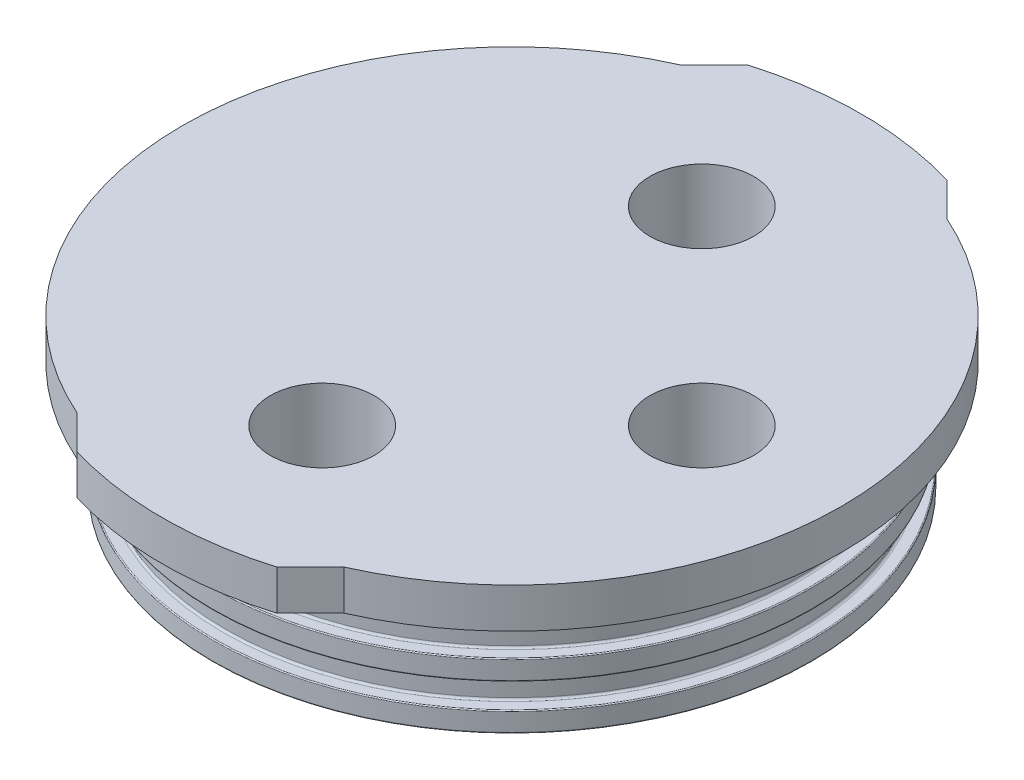
ISO-10303-21;
HEADER;
FILE_DESCRIPTION(('STEP AP214'),'2;1');
FILE_NAME('part.step','',(''),(''),'','','');
FILE_SCHEMA(('AUTOMOTIVE_DESIGN { 1 0 10303 214 1 1 1 1 }'));
ENDSEC;
DATA;
#1=APPLICATION_CONTEXT('core data for automotive mechanical design processes');
#2=APPLICATION_PROTOCOL_DEFINITION('international standard','automotive_design',2000,#1);
#3=PRODUCT_CONTEXT('',#1,'mechanical');
#4=PRODUCT('Part','Part','',(#3));
#5=PRODUCT_RELATED_PRODUCT_CATEGORY('part','',(#4));
#6=PRODUCT_DEFINITION_FORMATION('','',#4);
#7=PRODUCT_DEFINITION_CONTEXT('part definition',#1,'design');
#8=PRODUCT_DEFINITION('design','',#6,#7);
#9=PRODUCT_DEFINITION_SHAPE('','',#8);
#10=(LENGTH_UNIT() NAMED_UNIT(*) SI_UNIT(.MILLI.,.METRE.));
#11=(NAMED_UNIT(*) PLANE_ANGLE_UNIT() SI_UNIT($,.RADIAN.));
#12=(NAMED_UNIT(*) SI_UNIT($,.STERADIAN.) SOLID_ANGLE_UNIT());
#13=UNCERTAINTY_MEASURE_WITH_UNIT(LENGTH_MEASURE(1.E-05),#10,'distance_accuracy_value','');
#14=(GEOMETRIC_REPRESENTATION_CONTEXT(3) GLOBAL_UNCERTAINTY_ASSIGNED_CONTEXT((#13)) GLOBAL_UNIT_ASSIGNED_CONTEXT((#10,
#11,#12)) REPRESENTATION_CONTEXT('',''));
#15=CARTESIAN_POINT('',(0.,0.,0.));
#16=DIRECTION('',(0.,0.,1.));
#17=DIRECTION('',(1.,0.,0.));
#18=AXIS2_PLACEMENT_3D('',#15,#16,#17);
#19=CARTESIAN_POINT('',(0.,0.,0.));
#20=DIRECTION('',(0.,-1.,0.));
#21=DIRECTION('',(0.,0.,-1.));
#22=AXIS2_PLACEMENT_3D('',#19,#20,#21);
#23=CYLINDRICAL_SURFACE('',#22,33.);
#24=CARTESIAN_POINT('',(0.,11.,0.));
#25=DIRECTION('',(0.,-1.,0.));
#26=DIRECTION('',(0.,0.,-1.));
#27=AXIS2_PLACEMENT_3D('',#24,#25,#26);
#28=CIRCLE('',#27,33.);
#29=CARTESIAN_POINT('',(-13.3714085884062,11.,30.1696110740907));
#30=VERTEX_POINT('',#29);
#31=CARTESIAN_POINT('',(-13.3714085884061,11.,-30.1696110740907));
#32=VERTEX_POINT('',#31);
#33=EDGE_CURVE('E183',#30,#32,#28,.T.);
#34=ORIENTED_EDGE('',*,*,#33,.F.);
#35=DIRECTION('',(0.,1.,0.));
#36=VECTOR('',#35,1.);
#37=CARTESIAN_POINT('',(-13.3714085884062,-16.175557542173,30.1696110740907));
#38=LINE('',#37,#36);
#39=CARTESIAN_POINT('',(-13.3714085884062,15.,30.1696110740907));
#40=VERTEX_POINT('',#39);
#41=EDGE_CURVE('E51',#30,#40,#38,.T.);
#42=ORIENTED_EDGE('',*,*,#41,.T.);
#43=CARTESIAN_POINT('',(0.,15.,0.));
#44=DIRECTION('',(0.,-1.,0.));
#45=DIRECTION('',(0.,0.,-1.));
#46=AXIS2_PLACEMENT_3D('',#43,#44,#45);
#47=CIRCLE('',#46,33.);
#48=CARTESIAN_POINT('',(-13.3714085884061,15.,-30.1696110740907));
#49=VERTEX_POINT('',#48);
#50=EDGE_CURVE('E187',#40,#49,#47,.T.);
#51=ORIENTED_EDGE('',*,*,#50,.T.);
#52=DIRECTION('',(0.,1.,0.));
#53=VECTOR('',#52,1.);
#54=CARTESIAN_POINT('',(-13.3714085884061,-16.175557542173,-30.1696110740907));
#55=LINE('',#54,#53);
#56=EDGE_CURVE('E157',#32,#49,#55,.T.);
#57=ORIENTED_EDGE('',*,*,#56,.F.);
#58=EDGE_LOOP('',(#34,#42,#51,#57));
#59=FACE_BOUND('',#58,.T.);
#60=ADVANCED_FACE('F36',(#59),#23,.T.);
#61=CARTESIAN_POINT('',(0.,15.,0.));
#62=DIRECTION('',(0.,-1.,0.));
#63=DIRECTION('',(0.,0.,-1.));
#64=AXIS2_PLACEMENT_3D('',#61,#62,#63);
#65=PLANE('',#64);
#66=CARTESIAN_POINT('',(0.,15.,19.));
#67=DIRECTION('',(0.,-1.,0.));
#68=DIRECTION('',(0.,0.,-1.));
#69=AXIS2_PLACEMENT_3D('',#66,#67,#68);
#70=CIRCLE('',#69,5.2);
#71=CARTESIAN_POINT('',(0.,15.,13.8));
#72=VERTEX_POINT('',#71);
#73=EDGE_CURVE('E168',#72,#72,#70,.T.);
#74=ORIENTED_EDGE('',*,*,#73,.T.);
#75=EDGE_LOOP('',(#74));
#76=FACE_BOUND('',#75,.T.);
#77=CARTESIAN_POINT('',(13.3714085884062,15.,-30.1696110740907));
#78=VERTEX_POINT('',#77);
#79=CARTESIAN_POINT('',(13.3714085884061,15.,30.1696110740907));
#80=VERTEX_POINT('',#79);
#81=EDGE_CURVE('E188',#78,#80,#47,.T.);
#82=ORIENTED_EDGE('',*,*,#81,.F.);
#83=DIRECTION('',(-0.70710678118655,0.,-0.707106781186545));
#84=VECTOR('',#83,1.);
#85=CARTESIAN_POINT('',(10.,15.,-33.5410196624969));
#86=LINE('',#85,#84);
#87=CARTESIAN_POINT('',(10.,15.,-33.5410196624969));
#88=VERTEX_POINT('',#87);
#89=EDGE_CURVE('E148',#78,#88,#86,.T.);
#90=ORIENTED_EDGE('',*,*,#89,.T.);
#91=CARTESIAN_POINT('',(0.,15.,0.));
#92=DIRECTION('',(0.,1.,0.));
#93=DIRECTION('',(0.,0.,1.));
#94=AXIS2_PLACEMENT_3D('',#91,#92,#93);
#95=CIRCLE('',#94,35.);
#96=CARTESIAN_POINT('',(-10.,15.,-33.5410196624969));
#97=VERTEX_POINT('',#96);
#98=EDGE_CURVE('E151',#88,#97,#95,.T.);
#99=ORIENTED_EDGE('',*,*,#98,.T.);
#100=DIRECTION('',(-0.70710678118655,0.,0.707106781186545));
#101=VECTOR('',#100,1.);
#102=CARTESIAN_POINT('',(-10.,15.,-33.5410196624969));
#103=LINE('',#102,#101);
#104=EDGE_CURVE('E139',#97,#49,#103,.T.);
#105=ORIENTED_EDGE('',*,*,#104,.T.);
#106=ORIENTED_EDGE('',*,*,#50,.F.);
#107=DIRECTION('',(0.70710678118655,0.,0.707106781186545));
#108=VECTOR('',#107,1.);
#109=CARTESIAN_POINT('',(-10.,15.,33.5410196624969));
#110=LINE('',#109,#108);
#111=CARTESIAN_POINT('',(-10.,15.,33.5410196624969));
#112=VERTEX_POINT('',#111);
#113=EDGE_CURVE('E123',#40,#112,#110,.T.);
#114=ORIENTED_EDGE('',*,*,#113,.T.);
#115=CARTESIAN_POINT('',(0.,15.,0.));
#116=DIRECTION('',(0.,1.,0.));
#117=DIRECTION('',(0.,0.,-1.));
#118=AXIS2_PLACEMENT_3D('',#115,#116,#117);
#119=CIRCLE('',#118,35.);
#120=CARTESIAN_POINT('',(10.,15.,33.5410196624969));
#121=VERTEX_POINT('',#120);
#122=EDGE_CURVE('E108',#112,#121,#119,.T.);
#123=ORIENTED_EDGE('',*,*,#122,.T.);
#124=DIRECTION('',(0.70710678118655,0.,-0.707106781186545));
#125=VECTOR('',#124,1.);
#126=CARTESIAN_POINT('',(10.,15.,33.5410196624969));
#127=LINE('',#126,#125);
#128=EDGE_CURVE('E120',#121,#80,#127,.T.);
#129=ORIENTED_EDGE('',*,*,#128,.T.);
#130=EDGE_LOOP('',(#82,#90,#99,#105,#106,#114,#123,#129));
#131=FACE_BOUND('',#130,.T.);
#132=CARTESIAN_POINT('',(0.,15.,-19.));
#133=DIRECTION('',(0.,1.,0.));
#134=DIRECTION('',(0.,0.,1.));
#135=AXIS2_PLACEMENT_3D('',#132,#133,#134);
#136=CIRCLE('',#135,5.2);
#137=CARTESIAN_POINT('',(0.,15.,-13.8));
#138=VERTEX_POINT('',#137);
#139=EDGE_CURVE('E174',#138,#138,#136,.T.);
#140=ORIENTED_EDGE('',*,*,#139,.F.);
#141=EDGE_LOOP('',(#140));
#142=FACE_BOUND('',#141,.T.);
#143=CARTESIAN_POINT('',(19.,15.,0.));
#144=DIRECTION('',(0.,1.,0.));
#145=DIRECTION('',(-1.,0.,0.));
#146=AXIS2_PLACEMENT_3D('',#143,#144,#145);
#147=CIRCLE('',#146,5.2);
#148=CARTESIAN_POINT('',(13.8,15.,0.));
#149=VERTEX_POINT('',#148);
#150=EDGE_CURVE('E162',#149,#149,#147,.T.);
#151=ORIENTED_EDGE('',*,*,#150,.F.);
#152=EDGE_LOOP('',(#151));
#153=FACE_BOUND('',#152,.T.);
#154=ADVANCED_FACE('F118',(#76,#131,#142,#153),#65,.F.);
#155=CARTESIAN_POINT('',(-30.,0.,0.));
#156=DIRECTION('',(0.,1.,0.));
#157=DIRECTION('',(0.,0.,1.));
#158=AXIS2_PLACEMENT_3D('',#155,#156,#157);
#159=PLANE('',#158);
#160=CARTESIAN_POINT('',(0.,0.,0.));
#161=DIRECTION('',(0.,1.,0.));
#162=DIRECTION('',(0.,0.,1.));
#163=AXIS2_PLACEMENT_3D('',#160,#161,#162);
#164=CIRCLE('',#163,29.9);
#165=CARTESIAN_POINT('',(0.,0.,29.9));
#166=VERTEX_POINT('',#165);
#167=EDGE_CURVE('E217',#166,#166,#164,.F.);
#168=ORIENTED_EDGE('',*,*,#167,.T.);
#169=EDGE_LOOP('',(#168));
#170=FACE_BOUND('',#169,.T.);
#171=CARTESIAN_POINT('',(0.,0.,19.));
#172=DIRECTION('',(0.,-1.,0.));
#173=DIRECTION('',(0.,0.,-1.));
#174=AXIS2_PLACEMENT_3D('',#171,#172,#173);
#175=CIRCLE('',#174,5.2);
#176=CARTESIAN_POINT('',(0.,0.,13.8));
#177=VERTEX_POINT('',#176);
#178=EDGE_CURVE('E171',#177,#177,#175,.T.);
#179=ORIENTED_EDGE('',*,*,#178,.F.);
#180=EDGE_LOOP('',(#179));
#181=FACE_BOUND('',#180,.T.);
#182=CARTESIAN_POINT('',(0.,0.,-19.));
#183=DIRECTION('',(0.,1.,0.));
#184=DIRECTION('',(0.,0.,1.));
#185=AXIS2_PLACEMENT_3D('',#182,#183,#184);
#186=CIRCLE('',#185,5.2);
#187=CARTESIAN_POINT('',(0.,0.,-13.8));
#188=VERTEX_POINT('',#187);
#189=EDGE_CURVE('E177',#188,#188,#186,.T.);
#190=ORIENTED_EDGE('',*,*,#189,.T.);
#191=EDGE_LOOP('',(#190));
#192=FACE_BOUND('',#191,.T.);
#193=CARTESIAN_POINT('',(19.,0.,0.));
#194=DIRECTION('',(0.,1.,0.));
#195=DIRECTION('',(-1.,0.,0.));
#196=AXIS2_PLACEMENT_3D('',#193,#194,#195);
#197=CIRCLE('',#196,5.2);
#198=CARTESIAN_POINT('',(13.8,0.,0.));
#199=VERTEX_POINT('',#198);
#200=EDGE_CURVE('E165',#199,#199,#197,.T.);
#201=ORIENTED_EDGE('',*,*,#200,.T.);
#202=EDGE_LOOP('',(#201));
#203=FACE_BOUND('',#202,.T.);
#204=ADVANCED_FACE('F286',(#170,#181,#192,#203),#159,.F.);
#205=ORIENTED_EDGE('',*,*,#81,.T.);
#206=DIRECTION('',(0.,1.,0.));
#207=VECTOR('',#206,1.);
#208=CARTESIAN_POINT('',(13.3714085884061,-16.175557542173,30.1696110740907));
#209=LINE('',#208,#207);
#210=CARTESIAN_POINT('',(13.3714085884061,11.,30.1696110740907));
#211=VERTEX_POINT('',#210);
#212=EDGE_CURVE('E112',#211,#80,#209,.T.);
#213=ORIENTED_EDGE('',*,*,#212,.F.);
#214=CARTESIAN_POINT('',(13.3714085884062,11.,-30.1696110740907));
#215=VERTEX_POINT('',#214);
#216=EDGE_CURVE('E184',#215,#211,#28,.T.);
#217=ORIENTED_EDGE('',*,*,#216,.F.);
#218=DIRECTION('',(0.,1.,0.));
#219=VECTOR('',#218,1.);
#220=CARTESIAN_POINT('',(13.3714085884062,-16.175557542173,-30.1696110740907));
#221=LINE('',#220,#219);
#222=EDGE_CURVE('E59',#215,#78,#221,.T.);
#223=ORIENTED_EDGE('',*,*,#222,.T.);
#224=EDGE_LOOP('',(#205,#213,#217,#223));
#225=FACE_BOUND('',#224,.T.);
#226=ADVANCED_FACE('F289',(#225),#23,.T.);
#227=CARTESIAN_POINT('',(-33.,11.,0.));
#228=DIRECTION('',(0.,1.,0.));
#229=DIRECTION('',(0.,0.,1.));
#230=AXIS2_PLACEMENT_3D('',#227,#228,#229);
#231=PLANE('',#230);
#232=CARTESIAN_POINT('',(0.,11.,0.));
#233=DIRECTION('',(0.,-1.,0.));
#234=DIRECTION('',(0.,0.,-1.));
#235=AXIS2_PLACEMENT_3D('',#232,#233,#234);
#236=CIRCLE('',#235,30.);
#237=CARTESIAN_POINT('',(0.,11.,-30.));
#238=VERTEX_POINT('',#237);
#239=EDGE_CURVE('E180',#238,#238,#236,.T.);
#240=ORIENTED_EDGE('',*,*,#239,.F.);
#241=EDGE_LOOP('',(#240));
#242=FACE_BOUND('',#241,.T.);
#243=ORIENTED_EDGE('',*,*,#216,.T.);
#244=DIRECTION('',(-0.70710678118655,0.,0.707106781186545));
#245=VECTOR('',#244,1.);
#246=CARTESIAN_POINT('',(10.,11.,33.5410196624969));
#247=LINE('',#246,#245);
#248=CARTESIAN_POINT('',(10.,11.,33.5410196624969));
#249=VERTEX_POINT('',#248);
#250=EDGE_CURVE('E137',#211,#249,#247,.T.);
#251=ORIENTED_EDGE('',*,*,#250,.T.);
#252=CARTESIAN_POINT('',(0.,11.,0.));
#253=DIRECTION('',(0.,1.,0.));
#254=DIRECTION('',(0.,0.,1.));
#255=AXIS2_PLACEMENT_3D('',#252,#253,#254);
#256=CIRCLE('',#255,35.);
#257=CARTESIAN_POINT('',(-10.,11.,33.5410196624969));
#258=VERTEX_POINT('',#257);
#259=EDGE_CURVE('E109',#249,#258,#256,.F.);
#260=ORIENTED_EDGE('',*,*,#259,.T.);
#261=DIRECTION('',(-0.70710678118655,0.,-0.707106781186545));
#262=VECTOR('',#261,1.);
#263=CARTESIAN_POINT('',(-10.,11.,33.5410196624969));
#264=LINE('',#263,#262);
#265=EDGE_CURVE('E134',#258,#30,#264,.T.);
#266=ORIENTED_EDGE('',*,*,#265,.T.);
#267=ORIENTED_EDGE('',*,*,#33,.T.);
#268=DIRECTION('',(0.70710678118655,0.,-0.707106781186545));
#269=VECTOR('',#268,1.);
#270=CARTESIAN_POINT('',(-10.,11.,-33.5410196624969));
#271=LINE('',#270,#269);
#272=CARTESIAN_POINT('',(-10.,11.,-33.5410196624969));
#273=VERTEX_POINT('',#272);
#274=EDGE_CURVE('E145',#32,#273,#271,.T.);
#275=ORIENTED_EDGE('',*,*,#274,.T.);
#276=CARTESIAN_POINT('',(0.,11.,0.));
#277=DIRECTION('',(0.,1.,0.));
#278=DIRECTION('',(0.,0.,1.));
#279=AXIS2_PLACEMENT_3D('',#276,#277,#278);
#280=CIRCLE('',#279,35.);
#281=CARTESIAN_POINT('',(10.,11.,-33.5410196624969));
#282=VERTEX_POINT('',#281);
#283=EDGE_CURVE('E142',#273,#282,#280,.F.);
#284=ORIENTED_EDGE('',*,*,#283,.T.);
#285=DIRECTION('',(0.70710678118655,0.,0.707106781186545));
#286=VECTOR('',#285,1.);
#287=CARTESIAN_POINT('',(10.,11.,-33.5410196624969));
#288=LINE('',#287,#286);
#289=EDGE_CURVE('E140',#282,#215,#288,.T.);
#290=ORIENTED_EDGE('',*,*,#289,.T.);
#291=EDGE_LOOP('',(#243,#251,#260,#266,#267,#275,#284,#290));
#292=FACE_BOUND('',#291,.T.);
#293=ADVANCED_FACE('F324',(#242,#292),#231,.F.);
#294=CARTESIAN_POINT('',(0.,0.,0.));
#295=DIRECTION('',(0.,-1.,0.));
#296=DIRECTION('',(0.,0.,-1.));
#297=AXIS2_PLACEMENT_3D('',#294,#295,#296);
#298=CYLINDRICAL_SURFACE('',#297,30.);
#299=CARTESIAN_POINT('',(0.,9.1,0.));
#300=DIRECTION('',(0.,1.,0.));
#301=DIRECTION('',(0.,0.,1.));
#302=AXIS2_PLACEMENT_3D('',#299,#300,#301);
#303=CIRCLE('',#302,30.);
#304=CARTESIAN_POINT('',(0.,9.1,30.));
#305=VERTEX_POINT('',#304);
#306=EDGE_CURVE('E193',#305,#305,#303,.T.);
#307=ORIENTED_EDGE('',*,*,#306,.T.);
#308=EDGE_LOOP('',(#307));
#309=FACE_BOUND('',#308,.T.);
#310=ORIENTED_EDGE('',*,*,#239,.T.);
#311=EDGE_LOOP('',(#310));
#312=FACE_BOUND('',#311,.T.);
#313=ADVANCED_FACE('F329',(#309,#312),#298,.T.);
#314=CARTESIAN_POINT('',(-30.,9.,0.));
#315=DIRECTION('',(0.,1.,0.));
#316=DIRECTION('',(0.,0.,1.));
#317=AXIS2_PLACEMENT_3D('',#314,#315,#316);
#318=PLANE('',#317);
#319=CARTESIAN_POINT('',(0.,9.,0.));
#320=DIRECTION('',(0.,1.,0.));
#321=DIRECTION('',(0.,0.,1.));
#322=AXIS2_PLACEMENT_3D('',#319,#320,#321);
#323=CIRCLE('',#322,28.9);
#324=CARTESIAN_POINT('',(0.,9.,28.9));
#325=VERTEX_POINT('',#324);
#326=EDGE_CURVE('E226',#325,#325,#323,.T.);
#327=ORIENTED_EDGE('',*,*,#326,.T.);
#328=EDGE_LOOP('',(#327));
#329=FACE_BOUND('',#328,.T.);
#330=CARTESIAN_POINT('',(0.,9.,0.));
#331=DIRECTION('',(0.,1.,0.));
#332=DIRECTION('',(0.,0.,1.));
#333=AXIS2_PLACEMENT_3D('',#330,#331,#332);
#334=CIRCLE('',#333,29.9);
#335=CARTESIAN_POINT('',(0.,9.,29.9));
#336=VERTEX_POINT('',#335);
#337=EDGE_CURVE('E190',#336,#336,#334,.F.);
#338=ORIENTED_EDGE('',*,*,#337,.T.);
#339=EDGE_LOOP('',(#338));
#340=FACE_BOUND('',#339,.T.);
#341=ADVANCED_FACE('F398',(#329,#340),#318,.F.);
#342=CARTESIAN_POINT('',(0.,0.,0.));
#343=DIRECTION('',(0.,-1.,0.));
#344=DIRECTION('',(0.,0.,-1.));
#345=AXIS2_PLACEMENT_3D('',#342,#343,#344);
#346=CYLINDRICAL_SURFACE('',#345,28.7);
#347=CARTESIAN_POINT('',(0.,8.8,0.));
#348=DIRECTION('',(0.,1.,0.));
#349=DIRECTION('',(0.,0.,1.));
#350=AXIS2_PLACEMENT_3D('',#347,#348,#349);
#351=CIRCLE('',#350,28.7);
#352=CARTESIAN_POINT('',(0.,8.8,28.7));
#353=VERTEX_POINT('',#352);
#354=EDGE_CURVE('E223',#353,#353,#351,.F.);
#355=ORIENTED_EDGE('',*,*,#354,.T.);
#356=EDGE_LOOP('',(#355));
#357=FACE_BOUND('',#356,.T.);
#358=CARTESIAN_POINT('',(0.,6.7,0.));
#359=DIRECTION('',(0.,-1.,0.));
#360=DIRECTION('',(0.,0.,-1.));
#361=AXIS2_PLACEMENT_3D('',#358,#359,#360);
#362=CIRCLE('',#361,28.7);
#363=CARTESIAN_POINT('',(0.,6.7,-28.7));
#364=VERTEX_POINT('',#363);
#365=EDGE_CURVE('E220',#364,#364,#362,.F.);
#366=ORIENTED_EDGE('',*,*,#365,.T.);
#367=EDGE_LOOP('',(#366));
#368=FACE_BOUND('',#367,.T.);
#369=ADVANCED_FACE('F474',(#357,#368),#346,.T.);
#370=CARTESIAN_POINT('',(-28.7,6.5,0.));
#371=DIRECTION('',(0.,-1.,0.));
#372=DIRECTION('',(0.,0.,-1.));
#373=AXIS2_PLACEMENT_3D('',#370,#371,#372);
#374=PLANE('',#373);
#375=CARTESIAN_POINT('',(0.,6.5,0.));
#376=DIRECTION('',(0.,-1.,0.));
#377=DIRECTION('',(0.,0.,-1.));
#378=AXIS2_PLACEMENT_3D('',#375,#376,#377);
#379=CIRCLE('',#378,28.9);
#380=CARTESIAN_POINT('',(0.,6.5,-28.9));
#381=VERTEX_POINT('',#380);
#382=EDGE_CURVE('E229',#381,#381,#379,.T.);
#383=ORIENTED_EDGE('',*,*,#382,.T.);
#384=EDGE_LOOP('',(#383));
#385=FACE_BOUND('',#384,.T.);
#386=CARTESIAN_POINT('',(0.,6.5,0.));
#387=DIRECTION('',(0.,-1.,0.));
#388=DIRECTION('',(0.,0.,-1.));
#389=AXIS2_PLACEMENT_3D('',#386,#387,#388);
#390=CIRCLE('',#389,29.9);
#391=CARTESIAN_POINT('',(0.,6.5,-29.9));
#392=VERTEX_POINT('',#391);
#393=EDGE_CURVE('E202',#392,#392,#390,.F.);
#394=ORIENTED_EDGE('',*,*,#393,.T.);
#395=EDGE_LOOP('',(#394));
#396=FACE_BOUND('',#395,.T.);
#397=ADVANCED_FACE('F412',(#385,#396),#374,.F.);
#398=CARTESIAN_POINT('',(0.,0.,0.));
#399=DIRECTION('',(0.,-1.,0.));
#400=DIRECTION('',(0.,0.,-1.));
#401=AXIS2_PLACEMENT_3D('',#398,#399,#400);
#402=CYLINDRICAL_SURFACE('',#401,30.);
#403=CARTESIAN_POINT('',(0.,6.4,0.));
#404=DIRECTION('',(0.,-1.,0.));
#405=DIRECTION('',(0.,0.,-1.));
#406=AXIS2_PLACEMENT_3D('',#403,#404,#405);
#407=CIRCLE('',#406,30.);
#408=CARTESIAN_POINT('',(0.,6.4,-30.));
#409=VERTEX_POINT('',#408);
#410=EDGE_CURVE('E199',#409,#409,#407,.T.);
#411=ORIENTED_EDGE('',*,*,#410,.T.);
#412=EDGE_LOOP('',(#411));
#413=FACE_BOUND('',#412,.T.);
#414=CARTESIAN_POINT('',(0.,4.6,0.));
#415=DIRECTION('',(0.,1.,0.));
#416=DIRECTION('',(0.,0.,1.));
#417=AXIS2_PLACEMENT_3D('',#414,#415,#416);
#418=CIRCLE('',#417,30.);
#419=CARTESIAN_POINT('',(0.,4.6,30.));
#420=VERTEX_POINT('',#419);
#421=EDGE_CURVE('E196',#420,#420,#418,.T.);
#422=ORIENTED_EDGE('',*,*,#421,.T.);
#423=EDGE_LOOP('',(#422));
#424=FACE_BOUND('',#423,.T.);
#425=ADVANCED_FACE('F407',(#413,#424),#402,.T.);
#426=CARTESIAN_POINT('',(-30.,4.5,0.));
#427=DIRECTION('',(0.,1.,0.));
#428=DIRECTION('',(0.,0.,1.));
#429=AXIS2_PLACEMENT_3D('',#426,#427,#428);
#430=PLANE('',#429);
#431=CARTESIAN_POINT('',(0.,4.5,0.));
#432=DIRECTION('',(0.,1.,0.));
#433=DIRECTION('',(0.,0.,1.));
#434=AXIS2_PLACEMENT_3D('',#431,#432,#433);
#435=CIRCLE('',#434,28.9);
#436=CARTESIAN_POINT('',(0.,4.5,28.9));
#437=VERTEX_POINT('',#436);
#438=EDGE_CURVE('E44',#437,#437,#435,.T.);
#439=ORIENTED_EDGE('',*,*,#438,.T.);
#440=EDGE_LOOP('',(#439));
#441=FACE_BOUND('',#440,.T.);
#442=CARTESIAN_POINT('',(0.,4.5,0.));
#443=DIRECTION('',(0.,1.,0.));
#444=DIRECTION('',(0.,0.,1.));
#445=AXIS2_PLACEMENT_3D('',#442,#443,#444);
#446=CIRCLE('',#445,29.9);
#447=CARTESIAN_POINT('',(0.,4.5,29.9));
#448=VERTEX_POINT('',#447);
#449=EDGE_CURVE('E205',#448,#448,#446,.F.);
#450=ORIENTED_EDGE('',*,*,#449,.T.);
#451=EDGE_LOOP('',(#450));
#452=FACE_BOUND('',#451,.T.);
#453=ADVANCED_FACE('F240',(#441,#452),#430,.F.);
#454=CARTESIAN_POINT('',(0.,0.,0.));
#455=DIRECTION('',(0.,-1.,0.));
#456=DIRECTION('',(0.,0.,-1.));
#457=AXIS2_PLACEMENT_3D('',#454,#455,#456);
#458=CYLINDRICAL_SURFACE('',#457,28.7);
#459=CARTESIAN_POINT('',(0.,4.3,0.));
#460=DIRECTION('',(0.,1.,0.));
#461=DIRECTION('',(0.,0.,1.));
#462=AXIS2_PLACEMENT_3D('',#459,#460,#461);
#463=CIRCLE('',#462,28.7);
#464=CARTESIAN_POINT('',(0.,4.3,28.7));
#465=VERTEX_POINT('',#464);
#466=EDGE_CURVE('E235',#465,#465,#463,.F.);
#467=ORIENTED_EDGE('',*,*,#466,.T.);
#468=EDGE_LOOP('',(#467));
#469=FACE_BOUND('',#468,.T.);
#470=CARTESIAN_POINT('',(0.,2.2,0.));
#471=DIRECTION('',(0.,-1.,0.));
#472=DIRECTION('',(0.,0.,-1.));
#473=AXIS2_PLACEMENT_3D('',#470,#471,#472);
#474=CIRCLE('',#473,28.7);
#475=CARTESIAN_POINT('',(0.,2.2,-28.7));
#476=VERTEX_POINT('',#475);
#477=EDGE_CURVE('E232',#476,#476,#474,.F.);
#478=ORIENTED_EDGE('',*,*,#477,.T.);
#479=EDGE_LOOP('',(#478));
#480=FACE_BOUND('',#479,.T.);
#481=ADVANCED_FACE('F249',(#469,#480),#458,.T.);
#482=CARTESIAN_POINT('',(-28.7,2.,0.));
#483=DIRECTION('',(0.,-1.,0.));
#484=DIRECTION('',(0.,0.,-1.));
#485=AXIS2_PLACEMENT_3D('',#482,#483,#484);
#486=PLANE('',#485);
#487=CARTESIAN_POINT('',(0.,2.,0.));
#488=DIRECTION('',(0.,-1.,0.));
#489=DIRECTION('',(0.,0.,-1.));
#490=AXIS2_PLACEMENT_3D('',#487,#488,#489);
#491=CIRCLE('',#490,28.9);
#492=CARTESIAN_POINT('',(0.,2.,-28.9));
#493=VERTEX_POINT('',#492);
#494=EDGE_CURVE('E11',#493,#493,#491,.T.);
#495=ORIENTED_EDGE('',*,*,#494,.T.);
#496=EDGE_LOOP('',(#495));
#497=FACE_BOUND('',#496,.T.);
#498=CARTESIAN_POINT('',(0.,2.,0.));
#499=DIRECTION('',(0.,-1.,0.));
#500=DIRECTION('',(0.,0.,-1.));
#501=AXIS2_PLACEMENT_3D('',#498,#499,#500);
#502=CIRCLE('',#501,29.9);
#503=CARTESIAN_POINT('',(0.,2.,-29.9));
#504=VERTEX_POINT('',#503);
#505=EDGE_CURVE('E214',#504,#504,#502,.F.);
#506=ORIENTED_EDGE('',*,*,#505,.T.);
#507=EDGE_LOOP('',(#506));
#508=FACE_BOUND('',#507,.T.);
#509=ADVANCED_FACE('F252',(#497,#508),#486,.F.);
#510=CARTESIAN_POINT('',(0.,0.,0.));
#511=DIRECTION('',(0.,-1.,0.));
#512=DIRECTION('',(0.,0.,-1.));
#513=AXIS2_PLACEMENT_3D('',#510,#511,#512);
#514=CYLINDRICAL_SURFACE('',#513,30.);
#515=CARTESIAN_POINT('',(0.,1.9,0.));
#516=DIRECTION('',(0.,-1.,0.));
#517=DIRECTION('',(0.,0.,-1.));
#518=AXIS2_PLACEMENT_3D('',#515,#516,#517);
#519=CIRCLE('',#518,30.);
#520=CARTESIAN_POINT('',(0.,1.9,-30.));
#521=VERTEX_POINT('',#520);
#522=EDGE_CURVE('E211',#521,#521,#519,.T.);
#523=ORIENTED_EDGE('',*,*,#522,.T.);
#524=EDGE_LOOP('',(#523));
#525=FACE_BOUND('',#524,.T.);
#526=CARTESIAN_POINT('',(0.,0.1,0.));
#527=DIRECTION('',(0.,1.,0.));
#528=DIRECTION('',(0.,0.,1.));
#529=AXIS2_PLACEMENT_3D('',#526,#527,#528);
#530=CIRCLE('',#529,30.);
#531=CARTESIAN_POINT('',(0.,0.1,30.));
#532=VERTEX_POINT('',#531);
#533=EDGE_CURVE('E208',#532,#532,#530,.T.);
#534=ORIENTED_EDGE('',*,*,#533,.T.);
#535=EDGE_LOOP('',(#534));
#536=FACE_BOUND('',#535,.T.);
#537=ADVANCED_FACE('F262',(#525,#536),#514,.T.);
#538=CARTESIAN_POINT('',(0.,23.4828265882864,-19.));
#539=DIRECTION('',(0.,1.,0.));
#540=DIRECTION('',(0.,0.,1.));
#541=AXIS2_PLACEMENT_3D('',#538,#539,#540);
#542=CYLINDRICAL_SURFACE('',#541,5.2);
#543=ORIENTED_EDGE('',*,*,#139,.T.);
#544=EDGE_LOOP('',(#543));
#545=FACE_BOUND('',#544,.T.);
#546=ORIENTED_EDGE('',*,*,#189,.F.);
#547=EDGE_LOOP('',(#546));
#548=FACE_BOUND('',#547,.T.);
#549=ADVANCED_FACE('F276',(#545,#548),#542,.F.);
#550=CARTESIAN_POINT('',(0.,23.4828265882864,19.));
#551=DIRECTION('',(0.,1.,0.));
#552=DIRECTION('',(0.,0.,-1.));
#553=AXIS2_PLACEMENT_3D('',#550,#551,#552);
#554=CYLINDRICAL_SURFACE('',#553,5.2);
#555=ORIENTED_EDGE('',*,*,#73,.F.);
#556=EDGE_LOOP('',(#555));
#557=FACE_BOUND('',#556,.T.);
#558=ORIENTED_EDGE('',*,*,#178,.T.);
#559=EDGE_LOOP('',(#558));
#560=FACE_BOUND('',#559,.T.);
#561=ADVANCED_FACE('F300',(#557,#560),#554,.F.);
#562=CARTESIAN_POINT('',(19.,23.4828265882864,0.));
#563=DIRECTION('',(0.,1.,0.));
#564=DIRECTION('',(-1.,0.,0.));
#565=AXIS2_PLACEMENT_3D('',#562,#563,#564);
#566=CYLINDRICAL_SURFACE('',#565,5.2);
#567=ORIENTED_EDGE('',*,*,#150,.T.);
#568=EDGE_LOOP('',(#567));
#569=FACE_BOUND('',#568,.T.);
#570=ORIENTED_EDGE('',*,*,#200,.F.);
#571=EDGE_LOOP('',(#570));
#572=FACE_BOUND('',#571,.T.);
#573=ADVANCED_FACE('F297',(#569,#572),#566,.F.);
#574=CARTESIAN_POINT('',(0.,-16.175557542173,0.));
#575=DIRECTION('',(0.,1.,0.));
#576=DIRECTION('',(0.,0.,1.));
#577=AXIS2_PLACEMENT_3D('',#574,#575,#576);
#578=CYLINDRICAL_SURFACE('',#577,35.);
#579=ORIENTED_EDGE('',*,*,#283,.F.);
#580=DIRECTION('',(0.,1.,0.));
#581=VECTOR('',#580,1.);
#582=CARTESIAN_POINT('',(-10.,-16.175557542173,-33.5410196624969));
#583=LINE('',#582,#581);
#584=EDGE_CURVE('E154',#273,#97,#583,.T.);
#585=ORIENTED_EDGE('',*,*,#584,.T.);
#586=ORIENTED_EDGE('',*,*,#98,.F.);
#587=DIRECTION('',(0.,1.,0.));
#588=VECTOR('',#587,1.);
#589=CARTESIAN_POINT('',(10.,-16.175557542173,-33.5410196624969));
#590=LINE('',#589,#588);
#591=EDGE_CURVE('E143',#282,#88,#590,.T.);
#592=ORIENTED_EDGE('',*,*,#591,.F.);
#593=EDGE_LOOP('',(#579,#585,#586,#592));
#594=FACE_BOUND('',#593,.T.);
#595=ADVANCED_FACE('F299',(#594),#578,.T.);
#596=CARTESIAN_POINT('',(10.,-16.175557542173,-33.5410196624969));
#597=DIRECTION('',(0.707106781186545,0.,-0.70710678118655));
#598=DIRECTION('',(-0.70710678118655,0.,-0.707106781186545));
#599=AXIS2_PLACEMENT_3D('',#596,#597,#598);
#600=PLANE('',#599);
#601=ORIENTED_EDGE('',*,*,#289,.F.);
#602=ORIENTED_EDGE('',*,*,#591,.T.);
#603=ORIENTED_EDGE('',*,*,#89,.F.);
#604=ORIENTED_EDGE('',*,*,#222,.F.);
#605=EDGE_LOOP('',(#601,#602,#603,#604));
#606=FACE_BOUND('',#605,.T.);
#607=ADVANCED_FACE('F307',(#606),#600,.T.);
#608=CARTESIAN_POINT('',(-10.,-16.175557542173,-33.5410196624969));
#609=DIRECTION('',(-0.707106781186545,0.,-0.70710678118655));
#610=DIRECTION('',(-0.70710678118655,0.,0.707106781186545));
#611=AXIS2_PLACEMENT_3D('',#608,#609,#610);
#612=PLANE('',#611);
#613=ORIENTED_EDGE('',*,*,#274,.F.);
#614=ORIENTED_EDGE('',*,*,#56,.T.);
#615=ORIENTED_EDGE('',*,*,#104,.F.);
#616=ORIENTED_EDGE('',*,*,#584,.F.);
#617=EDGE_LOOP('',(#613,#614,#615,#616));
#618=FACE_BOUND('',#617,.T.);
#619=ADVANCED_FACE('F339',(#618),#612,.T.);
#620=CARTESIAN_POINT('',(0.,-16.175557542173,0.));
#621=DIRECTION('',(0.,1.,0.));
#622=DIRECTION('',(0.,0.,1.));
#623=AXIS2_PLACEMENT_3D('',#620,#621,#622);
#624=CYLINDRICAL_SURFACE('',#623,35.);
#625=ORIENTED_EDGE('',*,*,#259,.F.);
#626=DIRECTION('',(0.,1.,0.));
#627=VECTOR('',#626,1.);
#628=CARTESIAN_POINT('',(10.,-16.175557542173,33.5410196624969));
#629=LINE('',#628,#627);
#630=EDGE_CURVE('E104',#249,#121,#629,.T.);
#631=ORIENTED_EDGE('',*,*,#630,.T.);
#632=ORIENTED_EDGE('',*,*,#122,.F.);
#633=DIRECTION('',(0.,1.,0.));
#634=VECTOR('',#633,1.);
#635=CARTESIAN_POINT('',(-10.,-16.175557542173,33.5410196624969));
#636=LINE('',#635,#634);
#637=EDGE_CURVE('E132',#258,#112,#636,.T.);
#638=ORIENTED_EDGE('',*,*,#637,.F.);
#639=EDGE_LOOP('',(#625,#631,#632,#638));
#640=FACE_BOUND('',#639,.T.);
#641=ADVANCED_FACE('F106',(#640),#624,.T.);
#642=CARTESIAN_POINT('',(-10.,-16.175557542173,33.5410196624969));
#643=DIRECTION('',(-0.707106781186545,0.,0.70710678118655));
#644=DIRECTION('',(0.70710678118655,0.,0.707106781186545));
#645=AXIS2_PLACEMENT_3D('',#642,#643,#644);
#646=PLANE('',#645);
#647=ORIENTED_EDGE('',*,*,#265,.F.);
#648=ORIENTED_EDGE('',*,*,#637,.T.);
#649=ORIENTED_EDGE('',*,*,#113,.F.);
#650=ORIENTED_EDGE('',*,*,#41,.F.);
#651=EDGE_LOOP('',(#647,#648,#649,#650));
#652=FACE_BOUND('',#651,.T.);
#653=ADVANCED_FACE('F342',(#652),#646,.T.);
#654=CARTESIAN_POINT('',(10.,-16.175557542173,33.5410196624969));
#655=DIRECTION('',(0.707106781186545,0.,0.70710678118655));
#656=DIRECTION('',(0.70710678118655,0.,-0.707106781186545));
#657=AXIS2_PLACEMENT_3D('',#654,#655,#656);
#658=PLANE('',#657);
#659=ORIENTED_EDGE('',*,*,#250,.F.);
#660=ORIENTED_EDGE('',*,*,#212,.T.);
#661=ORIENTED_EDGE('',*,*,#128,.F.);
#662=ORIENTED_EDGE('',*,*,#630,.F.);
#663=EDGE_LOOP('',(#659,#660,#661,#662));
#664=FACE_BOUND('',#663,.T.);
#665=ADVANCED_FACE('F125',(#664),#658,.T.);
#666=CARTESIAN_POINT('',(0.,9.1,0.));
#667=DIRECTION('',(0.,1.,0.));
#668=DIRECTION('',(0.,0.,1.));
#669=AXIS2_PLACEMENT_3D('',#666,#667,#668);
#670=TOROIDAL_SURFACE('',#669,29.9,0.1);
#671=ORIENTED_EDGE('',*,*,#306,.F.);
#672=EDGE_LOOP('',(#671));
#673=FACE_BOUND('',#672,.T.);
#674=ORIENTED_EDGE('',*,*,#337,.F.);
#675=EDGE_LOOP('',(#674));
#676=FACE_BOUND('',#675,.T.);
#677=ADVANCED_FACE('F349',(#673,#676),#670,.T.);
#678=CARTESIAN_POINT('',(0.,6.4,0.));
#679=DIRECTION('',(0.,-1.,0.));
#680=DIRECTION('',(0.,0.,-1.));
#681=AXIS2_PLACEMENT_3D('',#678,#679,#680);
#682=TOROIDAL_SURFACE('',#681,29.9,0.1);
#683=ORIENTED_EDGE('',*,*,#393,.F.);
#684=EDGE_LOOP('',(#683));
#685=FACE_BOUND('',#684,.T.);
#686=ORIENTED_EDGE('',*,*,#410,.F.);
#687=EDGE_LOOP('',(#686));
#688=FACE_BOUND('',#687,.T.);
#689=ADVANCED_FACE('F434',(#685,#688),#682,.T.);
#690=CARTESIAN_POINT('',(0.,4.6,0.));
#691=DIRECTION('',(0.,1.,0.));
#692=DIRECTION('',(0.,0.,1.));
#693=AXIS2_PLACEMENT_3D('',#690,#691,#692);
#694=TOROIDAL_SURFACE('',#693,29.9,0.1);
#695=ORIENTED_EDGE('',*,*,#421,.F.);
#696=EDGE_LOOP('',(#695));
#697=FACE_BOUND('',#696,.T.);
#698=ORIENTED_EDGE('',*,*,#449,.F.);
#699=EDGE_LOOP('',(#698));
#700=FACE_BOUND('',#699,.T.);
#701=ADVANCED_FACE('F270',(#697,#700),#694,.T.);
#702=CARTESIAN_POINT('',(0.,1.9,0.));
#703=DIRECTION('',(0.,-1.,0.));
#704=DIRECTION('',(0.,0.,-1.));
#705=AXIS2_PLACEMENT_3D('',#702,#703,#704);
#706=TOROIDAL_SURFACE('',#705,29.9,0.1);
#707=ORIENTED_EDGE('',*,*,#505,.F.);
#708=EDGE_LOOP('',(#707));
#709=FACE_BOUND('',#708,.T.);
#710=ORIENTED_EDGE('',*,*,#522,.F.);
#711=EDGE_LOOP('',(#710));
#712=FACE_BOUND('',#711,.T.);
#713=ADVANCED_FACE('F266',(#709,#712),#706,.T.);
#714=CARTESIAN_POINT('',(0.,0.1,0.));
#715=DIRECTION('',(0.,1.,0.));
#716=DIRECTION('',(0.,0.,1.));
#717=AXIS2_PLACEMENT_3D('',#714,#715,#716);
#718=TOROIDAL_SURFACE('',#717,29.9,0.1);
#719=ORIENTED_EDGE('',*,*,#533,.F.);
#720=EDGE_LOOP('',(#719));
#721=FACE_BOUND('',#720,.T.);
#722=ORIENTED_EDGE('',*,*,#167,.F.);
#723=EDGE_LOOP('',(#722));
#724=FACE_BOUND('',#723,.T.);
#725=ADVANCED_FACE('F269',(#721,#724),#718,.T.);
#726=CARTESIAN_POINT('',(0.,8.8,0.));
#727=DIRECTION('',(0.,1.,0.));
#728=DIRECTION('',(0.,0.,1.));
#729=AXIS2_PLACEMENT_3D('',#726,#727,#728);
#730=TOROIDAL_SURFACE('',#729,28.9,0.2);
#731=ORIENTED_EDGE('',*,*,#326,.F.);
#732=EDGE_LOOP('',(#731));
#733=FACE_BOUND('',#732,.T.);
#734=ORIENTED_EDGE('',*,*,#354,.F.);
#735=EDGE_LOOP('',(#734));
#736=FACE_BOUND('',#735,.T.);
#737=ADVANCED_FACE('F282',(#733,#736),#730,.F.);
#738=CARTESIAN_POINT('',(0.,6.7,0.));
#739=DIRECTION('',(0.,-1.,0.));
#740=DIRECTION('',(0.,0.,-1.));
#741=AXIS2_PLACEMENT_3D('',#738,#739,#740);
#742=TOROIDAL_SURFACE('',#741,28.9,0.2);
#743=ORIENTED_EDGE('',*,*,#365,.F.);
#744=EDGE_LOOP('',(#743));
#745=FACE_BOUND('',#744,.T.);
#746=ORIENTED_EDGE('',*,*,#382,.F.);
#747=EDGE_LOOP('',(#746));
#748=FACE_BOUND('',#747,.T.);
#749=ADVANCED_FACE('F246',(#745,#748),#742,.F.);
#750=CARTESIAN_POINT('',(0.,4.3,0.));
#751=DIRECTION('',(0.,1.,0.));
#752=DIRECTION('',(0.,0.,1.));
#753=AXIS2_PLACEMENT_3D('',#750,#751,#752);
#754=TOROIDAL_SURFACE('',#753,28.9,0.2);
#755=ORIENTED_EDGE('',*,*,#438,.F.);
#756=EDGE_LOOP('',(#755));
#757=FACE_BOUND('',#756,.T.);
#758=ORIENTED_EDGE('',*,*,#466,.F.);
#759=EDGE_LOOP('',(#758));
#760=FACE_BOUND('',#759,.T.);
#761=ADVANCED_FACE('F243',(#757,#760),#754,.F.);
#762=CARTESIAN_POINT('',(0.,2.2,0.));
#763=DIRECTION('',(0.,-1.,0.));
#764=DIRECTION('',(0.,0.,-1.));
#765=AXIS2_PLACEMENT_3D('',#762,#763,#764);
#766=TOROIDAL_SURFACE('',#765,28.9,0.2);
#767=ORIENTED_EDGE('',*,*,#477,.F.);
#768=EDGE_LOOP('',(#767));
#769=FACE_BOUND('',#768,.T.);
#770=ORIENTED_EDGE('',*,*,#494,.F.);
#771=EDGE_LOOP('',(#770));
#772=FACE_BOUND('',#771,.T.);
#773=ADVANCED_FACE('F38',(#769,#772),#766,.F.);
#774=CLOSED_SHELL('',(#60,#154,#204,#226,#293,#313,#341,#369,#397,#425,#453,#481,#509,#537,#549,
#561,#573,#595,#607,#619,#641,#653,#665,#677,#689,#701,#713,#725,#737,#749,#761,#773));
#775=MANIFOLD_SOLID_BREP('B2',#774);
#776=ADVANCED_BREP_SHAPE_REPRESENTATION('',(#18,#775),#14);
#777=SHAPE_DEFINITION_REPRESENTATION(#9,#776);
ENDSEC;
END-ISO-10303-21;
